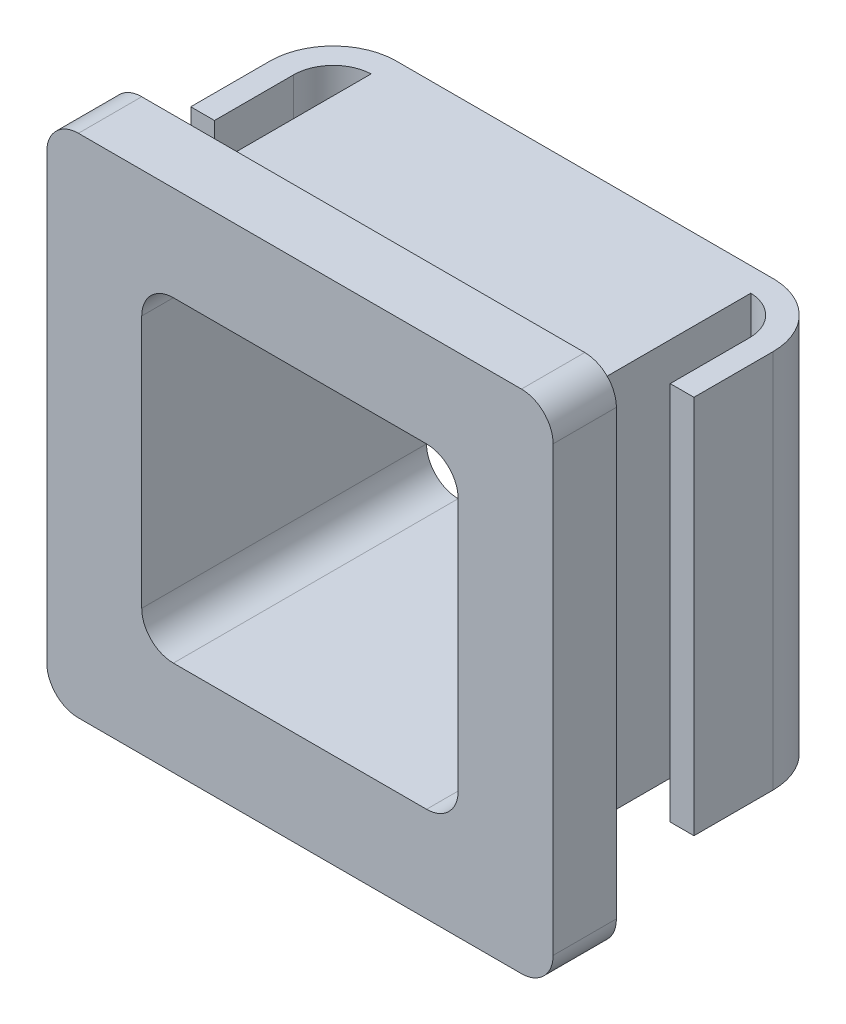
ISO-10303-21;
HEADER;
FILE_DESCRIPTION(('STEP AP214'),'2;1');
FILE_NAME('part.step','',(''),(''),'','','');
FILE_SCHEMA(('AUTOMOTIVE_DESIGN { 1 0 10303 214 1 1 1 1 }'));
ENDSEC;
DATA;
#1=APPLICATION_CONTEXT('core data for automotive mechanical design processes');
#2=APPLICATION_PROTOCOL_DEFINITION('international standard','automotive_design',2000,#1);
#3=PRODUCT_CONTEXT('',#1,'mechanical');
#4=PRODUCT('Part','Part','',(#3));
#5=PRODUCT_RELATED_PRODUCT_CATEGORY('part','',(#4));
#6=PRODUCT_DEFINITION_FORMATION('','',#4);
#7=PRODUCT_DEFINITION_CONTEXT('part definition',#1,'design');
#8=PRODUCT_DEFINITION('design','',#6,#7);
#9=PRODUCT_DEFINITION_SHAPE('','',#8);
#10=(LENGTH_UNIT() NAMED_UNIT(*) SI_UNIT(.MILLI.,.METRE.));
#11=(NAMED_UNIT(*) PLANE_ANGLE_UNIT() SI_UNIT($,.RADIAN.));
#12=(NAMED_UNIT(*) SI_UNIT($,.STERADIAN.) SOLID_ANGLE_UNIT());
#13=UNCERTAINTY_MEASURE_WITH_UNIT(LENGTH_MEASURE(1.E-05),#10,'distance_accuracy_value','');
#14=(GEOMETRIC_REPRESENTATION_CONTEXT(3) GLOBAL_UNCERTAINTY_ASSIGNED_CONTEXT((#13)) GLOBAL_UNIT_ASSIGNED_CONTEXT((#10,
#11,#12)) REPRESENTATION_CONTEXT('',''));
#15=CARTESIAN_POINT('',(0.,0.,0.));
#16=DIRECTION('',(0.,0.,1.));
#17=DIRECTION('',(1.,0.,0.));
#18=AXIS2_PLACEMENT_3D('',#15,#16,#17);
#19=CARTESIAN_POINT('',(6.,0.,-7.));
#20=DIRECTION('',(1.,0.,0.));
#21=DIRECTION('',(0.,0.,-1.));
#22=AXIS2_PLACEMENT_3D('',#19,#20,#21);
#23=PLANE('',#22);
#24=DIRECTION('',(0.,0.,1.));
#25=VECTOR('',#24,1.);
#26=CARTESIAN_POINT('',(6.,-6.,-7.));
#27=LINE('',#26,#25);
#28=CARTESIAN_POINT('',(6.,-6.,-6.24962500232614));
#29=VERTEX_POINT('',#28);
#30=CARTESIAN_POINT('',(6.,-6.,0.));
#31=VERTEX_POINT('',#30);
#32=EDGE_CURVE('E364',#29,#31,#27,.T.);
#33=ORIENTED_EDGE('',*,*,#32,.F.);
#34=DIRECTION('',(0.,1.,0.));
#35=VECTOR('',#34,1.);
#36=CARTESIAN_POINT('',(6.,-10.9045833166297,-6.24962500232614));
#37=LINE('',#36,#35);
#38=CARTESIAN_POINT('',(6.,6.,-6.24962500232614));
#39=VERTEX_POINT('',#38);
#40=EDGE_CURVE('E260',#29,#39,#37,.T.);
#41=ORIENTED_EDGE('',*,*,#40,.T.);
#42=DIRECTION('',(0.,0.,1.));
#43=VECTOR('',#42,1.);
#44=CARTESIAN_POINT('',(6.,6.,-7.));
#45=LINE('',#44,#43);
#46=CARTESIAN_POINT('',(6.,6.,0.));
#47=VERTEX_POINT('',#46);
#48=EDGE_CURVE('E275',#39,#47,#45,.T.);
#49=ORIENTED_EDGE('',*,*,#48,.T.);
#50=DIRECTION('',(0.,1.,0.));
#51=VECTOR('',#50,1.);
#52=CARTESIAN_POINT('',(6.,0.,0.));
#53=LINE('',#52,#51);
#54=EDGE_CURVE('E355',#31,#47,#53,.T.);
#55=ORIENTED_EDGE('',*,*,#54,.F.);
#56=EDGE_LOOP('',(#33,#41,#49,#55));
#57=FACE_BOUND('',#56,.T.);
#58=ADVANCED_FACE('F38',(#57),#23,.T.);
#59=CARTESIAN_POINT('',(0.,0.,0.));
#60=DIRECTION('',(0.,0.,-1.));
#61=DIRECTION('',(-1.,0.,0.));
#62=AXIS2_PLACEMENT_3D('',#59,#60,#61);
#63=PLANE('',#62);
#64=DIRECTION('',(0.,-1.,0.));
#65=VECTOR('',#64,1.);
#66=CARTESIAN_POINT('',(-8.,-8.,0.));
#67=LINE('',#66,#65);
#68=CARTESIAN_POINT('',(-8.,7.,0.));
#69=VERTEX_POINT('',#68);
#70=CARTESIAN_POINT('',(-8.,-7.,0.));
#71=VERTEX_POINT('',#70);
#72=EDGE_CURVE('E396',#69,#71,#67,.T.);
#73=ORIENTED_EDGE('',*,*,#72,.F.);
#74=CARTESIAN_POINT('',(-7.,7.,0.));
#75=DIRECTION('',(0.,0.,-1.));
#76=DIRECTION('',(-1.,0.,0.));
#77=AXIS2_PLACEMENT_3D('',#74,#75,#76);
#78=CIRCLE('',#77,1.);
#79=CARTESIAN_POINT('',(-7.,8.,0.));
#80=VERTEX_POINT('',#79);
#81=EDGE_CURVE('E448',#69,#80,#78,.T.);
#82=ORIENTED_EDGE('',*,*,#81,.T.);
#83=DIRECTION('',(-1.,0.,0.));
#84=VECTOR('',#83,1.);
#85=CARTESIAN_POINT('',(-8.,8.,0.));
#86=LINE('',#85,#84);
#87=CARTESIAN_POINT('',(7.,8.,0.));
#88=VERTEX_POINT('',#87);
#89=EDGE_CURVE('E393',#88,#80,#86,.T.);
#90=ORIENTED_EDGE('',*,*,#89,.F.);
#91=CARTESIAN_POINT('',(7.,7.,0.));
#92=DIRECTION('',(0.,0.,-1.));
#93=DIRECTION('',(-1.,0.,0.));
#94=AXIS2_PLACEMENT_3D('',#91,#92,#93);
#95=CIRCLE('',#94,1.);
#96=CARTESIAN_POINT('',(8.,7.,0.));
#97=VERTEX_POINT('',#96);
#98=EDGE_CURVE('E442',#88,#97,#95,.T.);
#99=ORIENTED_EDGE('',*,*,#98,.T.);
#100=DIRECTION('',(0.,1.,0.));
#101=VECTOR('',#100,1.);
#102=CARTESIAN_POINT('',(8.,-8.,0.));
#103=LINE('',#102,#101);
#104=CARTESIAN_POINT('',(8.,-7.,0.));
#105=VERTEX_POINT('',#104);
#106=EDGE_CURVE('E378',#105,#97,#103,.T.);
#107=ORIENTED_EDGE('',*,*,#106,.F.);
#108=CARTESIAN_POINT('',(7.,-7.,0.));
#109=DIRECTION('',(0.,0.,-1.));
#110=DIRECTION('',(-1.,0.,0.));
#111=AXIS2_PLACEMENT_3D('',#108,#109,#110);
#112=CIRCLE('',#111,1.);
#113=CARTESIAN_POINT('',(7.,-8.,0.));
#114=VERTEX_POINT('',#113);
#115=EDGE_CURVE('E444',#105,#114,#112,.T.);
#116=ORIENTED_EDGE('',*,*,#115,.T.);
#117=DIRECTION('',(1.,0.,0.));
#118=VECTOR('',#117,1.);
#119=CARTESIAN_POINT('',(-8.,-8.,0.));
#120=LINE('',#119,#118);
#121=CARTESIAN_POINT('',(-7.,-8.,0.));
#122=VERTEX_POINT('',#121);
#123=EDGE_CURVE('E383',#122,#114,#120,.T.);
#124=ORIENTED_EDGE('',*,*,#123,.F.);
#125=CARTESIAN_POINT('',(-7.,-7.,0.));
#126=DIRECTION('',(0.,0.,-1.));
#127=DIRECTION('',(-1.,0.,0.));
#128=AXIS2_PLACEMENT_3D('',#125,#126,#127);
#129=CIRCLE('',#128,1.);
#130=EDGE_CURVE('E446',#122,#71,#129,.T.);
#131=ORIENTED_EDGE('',*,*,#130,.T.);
#132=EDGE_LOOP('',(#73,#82,#90,#99,#107,#116,#124,#131));
#133=FACE_BOUND('',#132,.T.);
#134=DIRECTION('',(-1.,0.,0.));
#135=VECTOR('',#134,1.);
#136=CARTESIAN_POINT('',(0.,6.,0.));
#137=LINE('',#136,#135);
#138=CARTESIAN_POINT('',(-6.,6.,0.));
#139=VERTEX_POINT('',#138);
#140=EDGE_CURVE('E334',#47,#139,#137,.T.);
#141=ORIENTED_EDGE('',*,*,#140,.T.);
#142=DIRECTION('',(0.,1.,0.));
#143=VECTOR('',#142,1.);
#144=CARTESIAN_POINT('',(-6.,0.,0.));
#145=LINE('',#144,#143);
#146=CARTESIAN_POINT('',(-6.,-6.,0.));
#147=VERTEX_POINT('',#146);
#148=EDGE_CURVE('E329',#147,#139,#145,.T.);
#149=ORIENTED_EDGE('',*,*,#148,.F.);
#150=DIRECTION('',(-1.,0.,0.));
#151=VECTOR('',#150,1.);
#152=CARTESIAN_POINT('',(0.,-6.,0.));
#153=LINE('',#152,#151);
#154=EDGE_CURVE('E352',#31,#147,#153,.T.);
#155=ORIENTED_EDGE('',*,*,#154,.F.);
#156=ORIENTED_EDGE('',*,*,#54,.T.);
#157=EDGE_LOOP('',(#141,#149,#155,#156));
#158=FACE_BOUND('',#157,.T.);
#159=ADVANCED_FACE('F532',(#133,#158),#63,.T.);
#160=CARTESIAN_POINT('',(0.,0.,2.));
#161=DIRECTION('',(0.,0.,-1.));
#162=DIRECTION('',(-1.,0.,0.));
#163=AXIS2_PLACEMENT_3D('',#160,#161,#162);
#164=PLANE('',#163);
#165=DIRECTION('',(-1.,0.,0.));
#166=VECTOR('',#165,1.);
#167=CARTESIAN_POINT('',(-8.,8.,2.));
#168=LINE('',#167,#166);
#169=CARTESIAN_POINT('',(7.,8.,2.));
#170=VERTEX_POINT('',#169);
#171=CARTESIAN_POINT('',(-7.,8.,2.));
#172=VERTEX_POINT('',#171);
#173=EDGE_CURVE('E382',#170,#172,#168,.T.);
#174=ORIENTED_EDGE('',*,*,#173,.T.);
#175=CARTESIAN_POINT('',(-7.,7.,2.));
#176=DIRECTION('',(0.,0.,-1.));
#177=DIRECTION('',(-1.,0.,0.));
#178=AXIS2_PLACEMENT_3D('',#175,#176,#177);
#179=CIRCLE('',#178,1.);
#180=CARTESIAN_POINT('',(-8.,7.,2.));
#181=VERTEX_POINT('',#180);
#182=EDGE_CURVE('E460',#172,#181,#179,.F.);
#183=ORIENTED_EDGE('',*,*,#182,.T.);
#184=DIRECTION('',(0.,-1.,0.));
#185=VECTOR('',#184,1.);
#186=CARTESIAN_POINT('',(-8.,-8.,2.));
#187=LINE('',#186,#185);
#188=CARTESIAN_POINT('',(-8.,-7.,2.));
#189=VERTEX_POINT('',#188);
#190=EDGE_CURVE('E386',#181,#189,#187,.T.);
#191=ORIENTED_EDGE('',*,*,#190,.T.);
#192=CARTESIAN_POINT('',(-7.,-7.,2.));
#193=DIRECTION('',(0.,0.,-1.));
#194=DIRECTION('',(-1.,0.,0.));
#195=AXIS2_PLACEMENT_3D('',#192,#193,#194);
#196=CIRCLE('',#195,1.);
#197=CARTESIAN_POINT('',(-7.,-8.,2.));
#198=VERTEX_POINT('',#197);
#199=EDGE_CURVE('E60',#189,#198,#196,.F.);
#200=ORIENTED_EDGE('',*,*,#199,.T.);
#201=DIRECTION('',(1.,0.,0.));
#202=VECTOR('',#201,1.);
#203=CARTESIAN_POINT('',(-8.,-8.,2.));
#204=LINE('',#203,#202);
#205=CARTESIAN_POINT('',(7.,-8.,2.));
#206=VERTEX_POINT('',#205);
#207=EDGE_CURVE('E388',#198,#206,#204,.T.);
#208=ORIENTED_EDGE('',*,*,#207,.T.);
#209=CARTESIAN_POINT('',(7.,-7.,2.));
#210=DIRECTION('',(0.,0.,-1.));
#211=DIRECTION('',(-1.,0.,0.));
#212=AXIS2_PLACEMENT_3D('',#209,#210,#211);
#213=CIRCLE('',#212,1.);
#214=CARTESIAN_POINT('',(8.,-7.,2.));
#215=VERTEX_POINT('',#214);
#216=EDGE_CURVE('E457',#206,#215,#213,.F.);
#217=ORIENTED_EDGE('',*,*,#216,.T.);
#218=DIRECTION('',(0.,1.,0.));
#219=VECTOR('',#218,1.);
#220=CARTESIAN_POINT('',(8.,-8.,2.));
#221=LINE('',#220,#219);
#222=CARTESIAN_POINT('',(8.,7.,2.));
#223=VERTEX_POINT('',#222);
#224=EDGE_CURVE('E379',#215,#223,#221,.T.);
#225=ORIENTED_EDGE('',*,*,#224,.T.);
#226=CARTESIAN_POINT('',(7.,7.,2.));
#227=DIRECTION('',(0.,0.,-1.));
#228=DIRECTION('',(-1.,0.,0.));
#229=AXIS2_PLACEMENT_3D('',#226,#227,#228);
#230=CIRCLE('',#229,1.);
#231=EDGE_CURVE('E455',#223,#170,#230,.F.);
#232=ORIENTED_EDGE('',*,*,#231,.T.);
#233=EDGE_LOOP('',(#174,#183,#191,#200,#208,#217,#225,#232));
#234=FACE_BOUND('',#233,.T.);
#235=DIRECTION('',(0.,1.,0.));
#236=VECTOR('',#235,1.);
#237=CARTESIAN_POINT('',(5.,-5.,2.));
#238=LINE('',#237,#236);
#239=CARTESIAN_POINT('',(5.,-4.,2.));
#240=VERTEX_POINT('',#239);
#241=CARTESIAN_POINT('',(5.,4.,2.));
#242=VERTEX_POINT('',#241);
#243=EDGE_CURVE('E362',#240,#242,#238,.T.);
#244=ORIENTED_EDGE('',*,*,#243,.F.);
#245=CARTESIAN_POINT('',(4.,-4.,2.));
#246=DIRECTION('',(0.,0.,-1.));
#247=DIRECTION('',(-1.,0.,0.));
#248=AXIS2_PLACEMENT_3D('',#245,#246,#247);
#249=CIRCLE('',#248,1.);
#250=CARTESIAN_POINT('',(4.,-5.,2.));
#251=VERTEX_POINT('',#250);
#252=EDGE_CURVE('E473',#240,#251,#249,.T.);
#253=ORIENTED_EDGE('',*,*,#252,.T.);
#254=DIRECTION('',(1.,0.,0.));
#255=VECTOR('',#254,1.);
#256=CARTESIAN_POINT('',(-5.,-5.,2.));
#257=LINE('',#256,#255);
#258=CARTESIAN_POINT('',(-4.,-5.,2.));
#259=VERTEX_POINT('',#258);
#260=EDGE_CURVE('E375',#259,#251,#257,.T.);
#261=ORIENTED_EDGE('',*,*,#260,.F.);
#262=CARTESIAN_POINT('',(-4.,-4.,2.));
#263=DIRECTION('',(0.,0.,-1.));
#264=DIRECTION('',(-1.,0.,0.));
#265=AXIS2_PLACEMENT_3D('',#262,#263,#264);
#266=CIRCLE('',#265,1.);
#267=CARTESIAN_POINT('',(-5.,-4.,2.));
#268=VERTEX_POINT('',#267);
#269=EDGE_CURVE('E477',#259,#268,#266,.T.);
#270=ORIENTED_EDGE('',*,*,#269,.T.);
#271=DIRECTION('',(0.,-1.,0.));
#272=VECTOR('',#271,1.);
#273=CARTESIAN_POINT('',(-5.,-5.,2.));
#274=LINE('',#273,#272);
#275=CARTESIAN_POINT('',(-5.,4.,2.));
#276=VERTEX_POINT('',#275);
#277=EDGE_CURVE('E372',#276,#268,#274,.T.);
#278=ORIENTED_EDGE('',*,*,#277,.F.);
#279=CARTESIAN_POINT('',(-4.,4.,2.));
#280=DIRECTION('',(0.,0.,-1.));
#281=DIRECTION('',(-1.,0.,0.));
#282=AXIS2_PLACEMENT_3D('',#279,#280,#281);
#283=CIRCLE('',#282,1.);
#284=CARTESIAN_POINT('',(-4.,5.,2.));
#285=VERTEX_POINT('',#284);
#286=EDGE_CURVE('E481',#276,#285,#283,.T.);
#287=ORIENTED_EDGE('',*,*,#286,.T.);
#288=DIRECTION('',(-1.,0.,0.));
#289=VECTOR('',#288,1.);
#290=CARTESIAN_POINT('',(-5.,5.,2.));
#291=LINE('',#290,#289);
#292=CARTESIAN_POINT('',(4.,5.,2.));
#293=VERTEX_POINT('',#292);
#294=EDGE_CURVE('E369',#293,#285,#291,.T.);
#295=ORIENTED_EDGE('',*,*,#294,.F.);
#296=CARTESIAN_POINT('',(4.,4.,2.));
#297=DIRECTION('',(0.,0.,-1.));
#298=DIRECTION('',(-1.,0.,0.));
#299=AXIS2_PLACEMENT_3D('',#296,#297,#298);
#300=CIRCLE('',#299,1.);
#301=EDGE_CURVE('E11',#293,#242,#300,.T.);
#302=ORIENTED_EDGE('',*,*,#301,.T.);
#303=EDGE_LOOP('',(#244,#253,#261,#270,#278,#287,#295,#302));
#304=FACE_BOUND('',#303,.T.);
#305=ADVANCED_FACE('F497',(#234,#304),#164,.F.);
#306=CARTESIAN_POINT('',(8.,-8.,2.));
#307=DIRECTION('',(-1.,0.,0.));
#308=DIRECTION('',(0.,0.,1.));
#309=AXIS2_PLACEMENT_3D('',#306,#307,#308);
#310=PLANE('',#309);
#311=ORIENTED_EDGE('',*,*,#224,.F.);
#312=DIRECTION('',(0.,0.,-1.));
#313=VECTOR('',#312,1.);
#314=CARTESIAN_POINT('',(8.,-7.,2.));
#315=LINE('',#314,#313);
#316=EDGE_CURVE('E468',#215,#105,#315,.T.);
#317=ORIENTED_EDGE('',*,*,#316,.T.);
#318=ORIENTED_EDGE('',*,*,#106,.T.);
#319=DIRECTION('',(0.,0.,-1.));
#320=VECTOR('',#319,1.);
#321=CARTESIAN_POINT('',(8.,7.,2.));
#322=LINE('',#321,#320);
#323=EDGE_CURVE('E466',#97,#223,#322,.F.);
#324=ORIENTED_EDGE('',*,*,#323,.T.);
#325=EDGE_LOOP('',(#311,#317,#318,#324));
#326=FACE_BOUND('',#325,.T.);
#327=ADVANCED_FACE('F561',(#326),#310,.F.);
#328=CARTESIAN_POINT('',(-8.,8.,2.));
#329=DIRECTION('',(0.,-1.,0.));
#330=DIRECTION('',(0.,0.,-1.));
#331=AXIS2_PLACEMENT_3D('',#328,#329,#330);
#332=PLANE('',#331);
#333=ORIENTED_EDGE('',*,*,#89,.T.);
#334=DIRECTION('',(0.,0.,-1.));
#335=VECTOR('',#334,1.);
#336=CARTESIAN_POINT('',(-7.,8.,2.));
#337=LINE('',#336,#335);
#338=EDGE_CURVE('E453',#80,#172,#337,.F.);
#339=ORIENTED_EDGE('',*,*,#338,.T.);
#340=ORIENTED_EDGE('',*,*,#173,.F.);
#341=DIRECTION('',(0.,0.,-1.));
#342=VECTOR('',#341,1.);
#343=CARTESIAN_POINT('',(7.,8.,2.));
#344=LINE('',#343,#342);
#345=EDGE_CURVE('E450',#170,#88,#344,.T.);
#346=ORIENTED_EDGE('',*,*,#345,.T.);
#347=EDGE_LOOP('',(#333,#339,#340,#346));
#348=FACE_BOUND('',#347,.T.);
#349=ADVANCED_FACE('F568',(#348),#332,.F.);
#350=CARTESIAN_POINT('',(-8.,-8.,2.));
#351=DIRECTION('',(1.,0.,0.));
#352=DIRECTION('',(0.,0.,-1.));
#353=AXIS2_PLACEMENT_3D('',#350,#351,#352);
#354=PLANE('',#353);
#355=ORIENTED_EDGE('',*,*,#190,.F.);
#356=DIRECTION('',(0.,0.,-1.));
#357=VECTOR('',#356,1.);
#358=CARTESIAN_POINT('',(-8.,7.,2.));
#359=LINE('',#358,#357);
#360=EDGE_CURVE('E439',#181,#69,#359,.T.);
#361=ORIENTED_EDGE('',*,*,#360,.T.);
#362=ORIENTED_EDGE('',*,*,#72,.T.);
#363=DIRECTION('',(0.,0.,-1.));
#364=VECTOR('',#363,1.);
#365=CARTESIAN_POINT('',(-8.,-7.,2.));
#366=LINE('',#365,#364);
#367=EDGE_CURVE('E437',#71,#189,#366,.F.);
#368=ORIENTED_EDGE('',*,*,#367,.T.);
#369=EDGE_LOOP('',(#355,#361,#362,#368));
#370=FACE_BOUND('',#369,.T.);
#371=ADVANCED_FACE('F565',(#370),#354,.F.);
#372=CARTESIAN_POINT('',(-8.,-8.,2.));
#373=DIRECTION('',(0.,1.,0.));
#374=DIRECTION('',(0.,0.,1.));
#375=AXIS2_PLACEMENT_3D('',#372,#373,#374);
#376=PLANE('',#375);
#377=ORIENTED_EDGE('',*,*,#207,.F.);
#378=DIRECTION('',(0.,0.,-1.));
#379=VECTOR('',#378,1.);
#380=CARTESIAN_POINT('',(-7.,-8.,2.));
#381=LINE('',#380,#379);
#382=EDGE_CURVE('E463',#198,#122,#381,.T.);
#383=ORIENTED_EDGE('',*,*,#382,.T.);
#384=ORIENTED_EDGE('',*,*,#123,.T.);
#385=DIRECTION('',(0.,0.,-1.));
#386=VECTOR('',#385,1.);
#387=CARTESIAN_POINT('',(7.,-8.,2.));
#388=LINE('',#387,#386);
#389=EDGE_CURVE('E53',#114,#206,#388,.F.);
#390=ORIENTED_EDGE('',*,*,#389,.T.);
#391=EDGE_LOOP('',(#377,#383,#384,#390));
#392=FACE_BOUND('',#391,.T.);
#393=ADVANCED_FACE('F559',(#392),#376,.F.);
#394=CARTESIAN_POINT('',(5.,-5.,2.));
#395=DIRECTION('',(-1.,0.,0.));
#396=DIRECTION('',(0.,0.,1.));
#397=AXIS2_PLACEMENT_3D('',#394,#395,#396);
#398=PLANE('',#397);
#399=DIRECTION('',(0.,1.,0.));
#400=VECTOR('',#399,1.);
#401=CARTESIAN_POINT('',(5.,0.,-7.));
#402=LINE('',#401,#400);
#403=CARTESIAN_POINT('',(5.,-4.,-7.));
#404=VERTEX_POINT('',#403);
#405=CARTESIAN_POINT('',(5.,4.,-7.));
#406=VERTEX_POINT('',#405);
#407=EDGE_CURVE('E343',#404,#406,#402,.T.);
#408=ORIENTED_EDGE('',*,*,#407,.F.);
#409=DIRECTION('',(0.,0.,-1.));
#410=VECTOR('',#409,1.);
#411=CARTESIAN_POINT('',(5.,-4.,2.));
#412=LINE('',#411,#410);
#413=EDGE_CURVE('E425',#404,#240,#412,.F.);
#414=ORIENTED_EDGE('',*,*,#413,.T.);
#415=ORIENTED_EDGE('',*,*,#243,.T.);
#416=DIRECTION('',(0.,0.,-1.));
#417=VECTOR('',#416,1.);
#418=CARTESIAN_POINT('',(5.,4.,-7.));
#419=LINE('',#418,#417);
#420=EDGE_CURVE('E422',#242,#406,#419,.T.);
#421=ORIENTED_EDGE('',*,*,#420,.T.);
#422=EDGE_LOOP('',(#408,#414,#415,#421));
#423=FACE_BOUND('',#422,.T.);
#424=ADVANCED_FACE('F500',(#423),#398,.T.);
#425=CARTESIAN_POINT('',(-5.,5.,2.));
#426=DIRECTION('',(0.,-1.,0.));
#427=DIRECTION('',(0.,0.,-1.));
#428=AXIS2_PLACEMENT_3D('',#425,#426,#427);
#429=PLANE('',#428);
#430=ORIENTED_EDGE('',*,*,#294,.T.);
#431=DIRECTION('',(0.,0.,-1.));
#432=VECTOR('',#431,1.);
#433=CARTESIAN_POINT('',(-4.,5.,-7.));
#434=LINE('',#433,#432);
#435=CARTESIAN_POINT('',(-4.,5.,-7.));
#436=VERTEX_POINT('',#435);
#437=EDGE_CURVE('E434',#285,#436,#434,.T.);
#438=ORIENTED_EDGE('',*,*,#437,.T.);
#439=DIRECTION('',(-1.,0.,0.));
#440=VECTOR('',#439,1.);
#441=CARTESIAN_POINT('',(0.,5.,-7.));
#442=LINE('',#441,#440);
#443=CARTESIAN_POINT('',(4.,5.,-7.));
#444=VERTEX_POINT('',#443);
#445=EDGE_CURVE('E340',#444,#436,#442,.T.);
#446=ORIENTED_EDGE('',*,*,#445,.F.);
#447=DIRECTION('',(0.,0.,-1.));
#448=VECTOR('',#447,1.);
#449=CARTESIAN_POINT('',(4.,5.,2.));
#450=LINE('',#449,#448);
#451=EDGE_CURVE('E432',#444,#293,#450,.F.);
#452=ORIENTED_EDGE('',*,*,#451,.T.);
#453=EDGE_LOOP('',(#430,#438,#446,#452));
#454=FACE_BOUND('',#453,.T.);
#455=ADVANCED_FACE('F490',(#454),#429,.T.);
#456=CARTESIAN_POINT('',(-5.,-5.,2.));
#457=DIRECTION('',(1.,0.,0.));
#458=DIRECTION('',(0.,0.,-1.));
#459=AXIS2_PLACEMENT_3D('',#456,#457,#458);
#460=PLANE('',#459);
#461=ORIENTED_EDGE('',*,*,#277,.T.);
#462=DIRECTION('',(0.,0.,-1.));
#463=VECTOR('',#462,1.);
#464=CARTESIAN_POINT('',(-5.,-4.,-7.));
#465=LINE('',#464,#463);
#466=CARTESIAN_POINT('',(-5.,-4.,-7.));
#467=VERTEX_POINT('',#466);
#468=EDGE_CURVE('E429',#268,#467,#465,.T.);
#469=ORIENTED_EDGE('',*,*,#468,.T.);
#470=DIRECTION('',(0.,-1.,0.));
#471=VECTOR('',#470,1.);
#472=CARTESIAN_POINT('',(-5.,0.,-7.));
#473=LINE('',#472,#471);
#474=CARTESIAN_POINT('',(-5.,4.,-7.));
#475=VERTEX_POINT('',#474);
#476=EDGE_CURVE('E337',#475,#467,#473,.T.);
#477=ORIENTED_EDGE('',*,*,#476,.F.);
#478=DIRECTION('',(0.,0.,-1.));
#479=VECTOR('',#478,1.);
#480=CARTESIAN_POINT('',(-5.,4.,2.));
#481=LINE('',#480,#479);
#482=EDGE_CURVE('E427',#475,#276,#481,.F.);
#483=ORIENTED_EDGE('',*,*,#482,.T.);
#484=EDGE_LOOP('',(#461,#469,#477,#483));
#485=FACE_BOUND('',#484,.T.);
#486=ADVANCED_FACE('F517',(#485),#460,.T.);
#487=CARTESIAN_POINT('',(-5.,-5.,2.));
#488=DIRECTION('',(0.,1.,0.));
#489=DIRECTION('',(0.,0.,1.));
#490=AXIS2_PLACEMENT_3D('',#487,#488,#489);
#491=PLANE('',#490);
#492=ORIENTED_EDGE('',*,*,#260,.T.);
#493=DIRECTION('',(0.,0.,-1.));
#494=VECTOR('',#493,1.);
#495=CARTESIAN_POINT('',(4.,-5.,-7.));
#496=LINE('',#495,#494);
#497=CARTESIAN_POINT('',(4.,-5.,-7.));
#498=VERTEX_POINT('',#497);
#499=EDGE_CURVE('E419',#251,#498,#496,.T.);
#500=ORIENTED_EDGE('',*,*,#499,.T.);
#501=DIRECTION('',(1.,0.,0.));
#502=VECTOR('',#501,1.);
#503=CARTESIAN_POINT('',(0.,-5.,-7.));
#504=LINE('',#503,#502);
#505=CARTESIAN_POINT('',(-4.,-5.,-7.));
#506=VERTEX_POINT('',#505);
#507=EDGE_CURVE('E346',#506,#498,#504,.T.);
#508=ORIENTED_EDGE('',*,*,#507,.F.);
#509=DIRECTION('',(0.,0.,-1.));
#510=VECTOR('',#509,1.);
#511=CARTESIAN_POINT('',(-4.,-5.,2.));
#512=LINE('',#511,#510);
#513=EDGE_CURVE('E417',#506,#259,#512,.F.);
#514=ORIENTED_EDGE('',*,*,#513,.T.);
#515=EDGE_LOOP('',(#492,#500,#508,#514));
#516=FACE_BOUND('',#515,.T.);
#517=ADVANCED_FACE('F508',(#516),#491,.T.);
#518=CARTESIAN_POINT('',(-6.,0.,-7.));
#519=DIRECTION('',(1.,0.,0.));
#520=DIRECTION('',(0.,0.,-1.));
#521=AXIS2_PLACEMENT_3D('',#518,#519,#520);
#522=PLANE('',#521);
#523=DIRECTION('',(0.,0.,1.));
#524=VECTOR('',#523,1.);
#525=CARTESIAN_POINT('',(-6.,6.,-7.));
#526=LINE('',#525,#524);
#527=CARTESIAN_POINT('',(-6.,6.,-6.24962500232614));
#528=VERTEX_POINT('',#527);
#529=EDGE_CURVE('E360',#528,#139,#526,.T.);
#530=ORIENTED_EDGE('',*,*,#529,.F.);
#531=DIRECTION('',(0.,1.,0.));
#532=VECTOR('',#531,1.);
#533=CARTESIAN_POINT('',(-6.,-10.9045833166297,-6.24962500232614));
#534=LINE('',#533,#532);
#535=CARTESIAN_POINT('',(-6.,-6.,-6.24962500232614));
#536=VERTEX_POINT('',#535);
#537=EDGE_CURVE('E295',#536,#528,#534,.T.);
#538=ORIENTED_EDGE('',*,*,#537,.F.);
#539=DIRECTION('',(0.,0.,1.));
#540=VECTOR('',#539,1.);
#541=CARTESIAN_POINT('',(-6.,-6.,-7.));
#542=LINE('',#541,#540);
#543=EDGE_CURVE('E349',#536,#147,#542,.T.);
#544=ORIENTED_EDGE('',*,*,#543,.T.);
#545=ORIENTED_EDGE('',*,*,#148,.T.);
#546=EDGE_LOOP('',(#530,#538,#544,#545));
#547=FACE_BOUND('',#546,.T.);
#548=ADVANCED_FACE('F547',(#547),#522,.F.);
#549=CARTESIAN_POINT('',(0.,6.,-7.));
#550=DIRECTION('',(0.,1.,0.));
#551=DIRECTION('',(-1.,0.,0.));
#552=AXIS2_PLACEMENT_3D('',#549,#550,#551);
#553=PLANE('',#552);
#554=CARTESIAN_POINT('',(5.95,6.,-5.));
#555=DIRECTION('',(0.,-1.,0.));
#556=DIRECTION('',(1.,0.,0.));
#557=AXIS2_PLACEMENT_3D('',#554,#555,#556);
#558=CIRCLE('',#557,2.00062490237426);
#559=CARTESIAN_POINT('',(6.02069411888706,6.,-6.99937548788485));
#560=VERTEX_POINT('',#559);
#561=CARTESIAN_POINT('',(7.95062490237425,6.,-5.));
#562=VERTEX_POINT('',#561);
#563=EDGE_CURVE('E276',#560,#562,#558,.T.);
#564=ORIENTED_EDGE('',*,*,#563,.F.);
#565=CARTESIAN_POINT('',(5.98535810022451,6.,-6.));
#566=DIRECTION('',(0.,1.,0.));
#567=DIRECTION('',(-1.,0.,0.));
#568=AXIS2_PLACEMENT_3D('',#565,#566,#567);
#569=CIRCLE('',#568,1.);
#570=CARTESIAN_POINT('',(5.98535810022451,6.,-7.));
#571=VERTEX_POINT('',#570);
#572=EDGE_CURVE('E404',#560,#571,#569,.T.);
#573=ORIENTED_EDGE('',*,*,#572,.T.);
#574=DIRECTION('',(-1.,0.,0.));
#575=VECTOR('',#574,1.);
#576=CARTESIAN_POINT('',(0.,6.,-7.));
#577=LINE('',#576,#575);
#578=CARTESIAN_POINT('',(-5.98535810022451,6.,-7.));
#579=VERTEX_POINT('',#578);
#580=EDGE_CURVE('E333',#571,#579,#577,.T.);
#581=ORIENTED_EDGE('',*,*,#580,.T.);
#582=CARTESIAN_POINT('',(-5.98535810022451,6.,-6.));
#583=DIRECTION('',(0.,1.,0.));
#584=DIRECTION('',(-1.,0.,0.));
#585=AXIS2_PLACEMENT_3D('',#582,#583,#584);
#586=CIRCLE('',#585,1.);
#587=CARTESIAN_POINT('',(-6.02069411888706,6.,-6.99937548788485));
#588=VERTEX_POINT('',#587);
#589=EDGE_CURVE('E402',#579,#588,#586,.T.);
#590=ORIENTED_EDGE('',*,*,#589,.T.);
#591=CARTESIAN_POINT('',(-5.95,6.,-5.));
#592=DIRECTION('',(0.,1.,0.));
#593=DIRECTION('',(-1.,0.,0.));
#594=AXIS2_PLACEMENT_3D('',#591,#592,#593);
#595=CIRCLE('',#594,2.00062490237426);
#596=CARTESIAN_POINT('',(-7.95062490237425,6.,-5.));
#597=VERTEX_POINT('',#596);
#598=EDGE_CURVE('E303',#588,#597,#595,.T.);
#599=ORIENTED_EDGE('',*,*,#598,.T.);
#600=DIRECTION('',(0.,0.,1.));
#601=VECTOR('',#600,1.);
#602=CARTESIAN_POINT('',(-7.95062490237425,6.,-5.));
#603=LINE('',#602,#601);
#604=CARTESIAN_POINT('',(-7.95062490237425,6.,-2.5));
#605=VERTEX_POINT('',#604);
#606=EDGE_CURVE('E305',#597,#605,#603,.T.);
#607=ORIENTED_EDGE('',*,*,#606,.T.);
#608=DIRECTION('',(1.,0.,0.));
#609=VECTOR('',#608,1.);
#610=CARTESIAN_POINT('',(-7.95062490237425,6.,-2.5));
#611=LINE('',#610,#609);
#612=CARTESIAN_POINT('',(-7.20062490237425,6.,-2.5));
#613=VERTEX_POINT('',#612);
#614=EDGE_CURVE('E309',#605,#613,#611,.T.);
#615=ORIENTED_EDGE('',*,*,#614,.T.);
#616=DIRECTION('',(0.,0.,-1.));
#617=VECTOR('',#616,1.);
#618=CARTESIAN_POINT('',(-7.20062490237425,6.,-2.5));
#619=LINE('',#618,#617);
#620=CARTESIAN_POINT('',(-7.20062490237425,6.,-5.));
#621=VERTEX_POINT('',#620);
#622=EDGE_CURVE('E312',#613,#621,#619,.T.);
#623=ORIENTED_EDGE('',*,*,#622,.T.);
#624=CARTESIAN_POINT('',(-5.95,6.,-5.));
#625=DIRECTION('',(0.,-1.,0.));
#626=DIRECTION('',(-1.,0.,0.));
#627=AXIS2_PLACEMENT_3D('',#624,#625,#626);
#628=CIRCLE('',#627,1.25062490237426);
#629=EDGE_CURVE('E315',#621,#528,#628,.T.);
#630=ORIENTED_EDGE('',*,*,#629,.T.);
#631=ORIENTED_EDGE('',*,*,#529,.T.);
#632=ORIENTED_EDGE('',*,*,#140,.F.);
#633=ORIENTED_EDGE('',*,*,#48,.F.);
#634=CARTESIAN_POINT('',(5.95,6.,-5.));
#635=DIRECTION('',(0.,1.,0.));
#636=DIRECTION('',(1.,0.,0.));
#637=AXIS2_PLACEMENT_3D('',#634,#635,#636);
#638=CIRCLE('',#637,1.25062490237426);
#639=CARTESIAN_POINT('',(7.20062490237425,6.,-5.));
#640=VERTEX_POINT('',#639);
#641=EDGE_CURVE('E254',#640,#39,#638,.T.);
#642=ORIENTED_EDGE('',*,*,#641,.F.);
#643=DIRECTION('',(0.,0.,-1.));
#644=VECTOR('',#643,1.);
#645=CARTESIAN_POINT('',(7.20062490237425,6.,-2.5));
#646=LINE('',#645,#644);
#647=CARTESIAN_POINT('',(7.20062490237425,6.,-2.5));
#648=VERTEX_POINT('',#647);
#649=EDGE_CURVE('E263',#648,#640,#646,.T.);
#650=ORIENTED_EDGE('',*,*,#649,.F.);
#651=DIRECTION('',(-1.,0.,0.));
#652=VECTOR('',#651,1.);
#653=CARTESIAN_POINT('',(7.95062490237425,6.,-2.5));
#654=LINE('',#653,#652);
#655=CARTESIAN_POINT('',(7.95062490237425,6.,-2.5));
#656=VERTEX_POINT('',#655);
#657=EDGE_CURVE('E269',#656,#648,#654,.T.);
#658=ORIENTED_EDGE('',*,*,#657,.F.);
#659=DIRECTION('',(0.,0.,1.));
#660=VECTOR('',#659,1.);
#661=CARTESIAN_POINT('',(7.95062490237425,6.,-5.));
#662=LINE('',#661,#660);
#663=EDGE_CURVE('E282',#562,#656,#662,.T.);
#664=ORIENTED_EDGE('',*,*,#663,.F.);
#665=EDGE_LOOP('',(#564,#573,#581,#590,#599,#607,#615,#623,#630,#631,#632,#633,#642,#650,#658,#664));
#666=FACE_BOUND('',#665,.T.);
#667=ADVANCED_FACE('F273',(#666),#553,.T.);
#668=CARTESIAN_POINT('',(0.,-6.,-7.));
#669=DIRECTION('',(0.,1.,0.));
#670=DIRECTION('',(-1.,0.,0.));
#671=AXIS2_PLACEMENT_3D('',#668,#669,#670);
#672=PLANE('',#671);
#673=DIRECTION('',(-1.,0.,0.));
#674=VECTOR('',#673,1.);
#675=CARTESIAN_POINT('',(0.,-6.,-7.));
#676=LINE('',#675,#674);
#677=CARTESIAN_POINT('',(5.9853581002245,-6.,-7.));
#678=VERTEX_POINT('',#677);
#679=CARTESIAN_POINT('',(-5.9853581002245,-6.,-7.));
#680=VERTEX_POINT('',#679);
#681=EDGE_CURVE('E330',#678,#680,#676,.T.);
#682=ORIENTED_EDGE('',*,*,#681,.F.);
#683=CARTESIAN_POINT('',(5.9853581002245,-6.,-6.));
#684=DIRECTION('',(0.,1.,0.));
#685=DIRECTION('',(-1.,0.,0.));
#686=AXIS2_PLACEMENT_3D('',#683,#684,#685);
#687=CIRCLE('',#686,1.);
#688=CARTESIAN_POINT('',(6.02069411888705,-6.,-6.99937548788485));
#689=VERTEX_POINT('',#688);
#690=EDGE_CURVE('E413',#678,#689,#687,.F.);
#691=ORIENTED_EDGE('',*,*,#690,.T.);
#692=CARTESIAN_POINT('',(5.95,-6.,-5.));
#693=DIRECTION('',(0.,1.,0.));
#694=DIRECTION('',(-1.,0.,0.));
#695=AXIS2_PLACEMENT_3D('',#692,#693,#694);
#696=CIRCLE('',#695,2.00062490237426);
#697=CARTESIAN_POINT('',(7.95062490237425,-6.,-5.));
#698=VERTEX_POINT('',#697);
#699=EDGE_CURVE('E306',#698,#689,#696,.T.);
#700=ORIENTED_EDGE('',*,*,#699,.F.);
#701=DIRECTION('',(0.,0.,-1.));
#702=VECTOR('',#701,1.);
#703=CARTESIAN_POINT('',(7.95062490237425,-6.,-5.));
#704=LINE('',#703,#702);
#705=CARTESIAN_POINT('',(7.95062490237425,-6.,-2.5));
#706=VERTEX_POINT('',#705);
#707=EDGE_CURVE('E677',#706,#698,#704,.T.);
#708=ORIENTED_EDGE('',*,*,#707,.F.);
#709=DIRECTION('',(1.,0.,0.));
#710=VECTOR('',#709,1.);
#711=CARTESIAN_POINT('',(7.95062490237425,-6.,-2.5));
#712=LINE('',#711,#710);
#713=CARTESIAN_POINT('',(7.20062490237425,-6.,-2.5));
#714=VERTEX_POINT('',#713);
#715=EDGE_CURVE('E672',#714,#706,#712,.T.);
#716=ORIENTED_EDGE('',*,*,#715,.F.);
#717=DIRECTION('',(0.,0.,1.));
#718=VECTOR('',#717,1.);
#719=CARTESIAN_POINT('',(7.20062490237425,-6.,-2.5));
#720=LINE('',#719,#718);
#721=CARTESIAN_POINT('',(7.20062490237425,-6.,-5.));
#722=VERTEX_POINT('',#721);
#723=EDGE_CURVE('E670',#722,#714,#720,.T.);
#724=ORIENTED_EDGE('',*,*,#723,.F.);
#725=CARTESIAN_POINT('',(5.95,-6.,-5.));
#726=DIRECTION('',(0.,1.,0.));
#727=DIRECTION('',(-1.,0.,0.));
#728=AXIS2_PLACEMENT_3D('',#725,#726,#727);
#729=CIRCLE('',#728,1.25062490237426);
#730=EDGE_CURVE('E256',#29,#722,#729,.F.);
#731=ORIENTED_EDGE('',*,*,#730,.F.);
#732=ORIENTED_EDGE('',*,*,#32,.T.);
#733=ORIENTED_EDGE('',*,*,#154,.T.);
#734=ORIENTED_EDGE('',*,*,#543,.F.);
#735=CARTESIAN_POINT('',(-5.95,-6.,-5.));
#736=DIRECTION('',(0.,1.,0.));
#737=DIRECTION('',(-1.,0.,0.));
#738=AXIS2_PLACEMENT_3D('',#735,#736,#737);
#739=CIRCLE('',#738,1.25062490237426);
#740=CARTESIAN_POINT('',(-7.20062490237425,-6.,-5.));
#741=VERTEX_POINT('',#740);
#742=EDGE_CURVE('E297',#536,#741,#739,.T.);
#743=ORIENTED_EDGE('',*,*,#742,.T.);
#744=DIRECTION('',(0.,0.,1.));
#745=VECTOR('',#744,1.);
#746=CARTESIAN_POINT('',(-7.20062490237425,-6.,-2.5));
#747=LINE('',#746,#745);
#748=CARTESIAN_POINT('',(-7.20062490237425,-6.,-2.5));
#749=VERTEX_POINT('',#748);
#750=EDGE_CURVE('E294',#741,#749,#747,.T.);
#751=ORIENTED_EDGE('',*,*,#750,.T.);
#752=DIRECTION('',(-1.,0.,0.));
#753=VECTOR('',#752,1.);
#754=CARTESIAN_POINT('',(-7.95062490237425,-6.,-2.5));
#755=LINE('',#754,#753);
#756=CARTESIAN_POINT('',(-7.95062490237425,-6.,-2.5));
#757=VERTEX_POINT('',#756);
#758=EDGE_CURVE('E292',#749,#757,#755,.T.);
#759=ORIENTED_EDGE('',*,*,#758,.T.);
#760=DIRECTION('',(0.,0.,-1.));
#761=VECTOR('',#760,1.);
#762=CARTESIAN_POINT('',(-7.95062490237425,-6.,-5.));
#763=LINE('',#762,#761);
#764=CARTESIAN_POINT('',(-7.95062490237425,-6.,-5.));
#765=VERTEX_POINT('',#764);
#766=EDGE_CURVE('E302',#757,#765,#763,.T.);
#767=ORIENTED_EDGE('',*,*,#766,.T.);
#768=CARTESIAN_POINT('',(-5.95,-6.,-5.));
#769=DIRECTION('',(0.,1.,0.));
#770=DIRECTION('',(-1.,0.,0.));
#771=AXIS2_PLACEMENT_3D('',#768,#769,#770);
#772=CIRCLE('',#771,2.00062490237426);
#773=CARTESIAN_POINT('',(-6.02069411888705,-6.,-6.99937548788485));
#774=VERTEX_POINT('',#773);
#775=EDGE_CURVE('E299',#765,#774,#772,.F.);
#776=ORIENTED_EDGE('',*,*,#775,.T.);
#777=CARTESIAN_POINT('',(-5.9853581002245,-6.,-6.));
#778=DIRECTION('',(0.,1.,0.));
#779=DIRECTION('',(-1.,0.,0.));
#780=AXIS2_PLACEMENT_3D('',#777,#778,#779);
#781=CIRCLE('',#780,1.);
#782=EDGE_CURVE('E411',#774,#680,#781,.F.);
#783=ORIENTED_EDGE('',*,*,#782,.T.);
#784=EDGE_LOOP('',(#682,#691,#700,#708,#716,#724,#731,#732,#733,#734,#743,#751,#759,#767,#776,#783));
#785=FACE_BOUND('',#784,.T.);
#786=ADVANCED_FACE('F543',(#785),#672,.F.);
#787=CARTESIAN_POINT('',(0.,0.,-7.));
#788=DIRECTION('',(0.,0.,1.));
#789=DIRECTION('',(1.,0.,0.));
#790=AXIS2_PLACEMENT_3D('',#787,#788,#789);
#791=PLANE('',#790);
#792=ORIENTED_EDGE('',*,*,#580,.F.);
#793=DIRECTION('',(0.,1.,0.));
#794=VECTOR('',#793,1.);
#795=CARTESIAN_POINT('',(5.98535810022451,0.,-7.));
#796=LINE('',#795,#794);
#797=EDGE_CURVE('E409',#571,#678,#796,.F.);
#798=ORIENTED_EDGE('',*,*,#797,.T.);
#799=ORIENTED_EDGE('',*,*,#681,.T.);
#800=DIRECTION('',(0.,-1.,0.));
#801=VECTOR('',#800,1.);
#802=CARTESIAN_POINT('',(-5.98535810022451,6.,-7.));
#803=LINE('',#802,#801);
#804=EDGE_CURVE('E406',#680,#579,#803,.F.);
#805=ORIENTED_EDGE('',*,*,#804,.T.);
#806=EDGE_LOOP('',(#792,#798,#799,#805));
#807=FACE_BOUND('',#806,.T.);
#808=ORIENTED_EDGE('',*,*,#445,.T.);
#809=CARTESIAN_POINT('',(-4.,4.,-7.));
#810=DIRECTION('',(0.,0.,1.));
#811=DIRECTION('',(1.,0.,0.));
#812=AXIS2_PLACEMENT_3D('',#809,#810,#811);
#813=CIRCLE('',#812,1.);
#814=EDGE_CURVE('E479',#436,#475,#813,.T.);
#815=ORIENTED_EDGE('',*,*,#814,.T.);
#816=ORIENTED_EDGE('',*,*,#476,.T.);
#817=CARTESIAN_POINT('',(-4.,-4.,-7.));
#818=DIRECTION('',(0.,0.,1.));
#819=DIRECTION('',(1.,0.,0.));
#820=AXIS2_PLACEMENT_3D('',#817,#818,#819);
#821=CIRCLE('',#820,1.);
#822=EDGE_CURVE('E475',#467,#506,#821,.T.);
#823=ORIENTED_EDGE('',*,*,#822,.T.);
#824=ORIENTED_EDGE('',*,*,#507,.T.);
#825=CARTESIAN_POINT('',(4.,-4.,-7.));
#826=DIRECTION('',(0.,0.,1.));
#827=DIRECTION('',(1.,0.,0.));
#828=AXIS2_PLACEMENT_3D('',#825,#826,#827);
#829=CIRCLE('',#828,1.);
#830=EDGE_CURVE('E471',#498,#404,#829,.T.);
#831=ORIENTED_EDGE('',*,*,#830,.T.);
#832=ORIENTED_EDGE('',*,*,#407,.T.);
#833=CARTESIAN_POINT('',(4.,4.,-7.));
#834=DIRECTION('',(0.,0.,1.));
#835=DIRECTION('',(1.,0.,0.));
#836=AXIS2_PLACEMENT_3D('',#833,#834,#835);
#837=CIRCLE('',#836,1.);
#838=EDGE_CURVE('E46',#406,#444,#837,.T.);
#839=ORIENTED_EDGE('',*,*,#838,.T.);
#840=EDGE_LOOP('',(#808,#815,#816,#823,#824,#831,#832,#839));
#841=FACE_BOUND('',#840,.T.);
#842=ADVANCED_FACE('F484',(#807,#841),#791,.F.);
#843=CARTESIAN_POINT('',(-5.94999999999999,-10.9045833166297,-5.));
#844=DIRECTION('',(0.,1.,0.));
#845=DIRECTION('',(-1.,0.,0.));
#846=AXIS2_PLACEMENT_3D('',#843,#844,#845);
#847=CYLINDRICAL_SURFACE('',#846,2.00062490237426);
#848=ORIENTED_EDGE('',*,*,#598,.F.);
#849=DIRECTION('',(0.,1.,0.));
#850=VECTOR('',#849,1.);
#851=CARTESIAN_POINT('',(-6.02069411888705,-10.9045833166297,-6.99937548788485));
#852=LINE('',#851,#850);
#853=EDGE_CURVE('E415',#588,#774,#852,.F.);
#854=ORIENTED_EDGE('',*,*,#853,.T.);
#855=ORIENTED_EDGE('',*,*,#775,.F.);
#856=DIRECTION('',(0.,1.,0.));
#857=VECTOR('',#856,1.);
#858=CARTESIAN_POINT('',(-7.95062490237425,-10.9045833166297,-5.));
#859=LINE('',#858,#857);
#860=EDGE_CURVE('E318',#765,#597,#859,.T.);
#861=ORIENTED_EDGE('',*,*,#860,.T.);
#862=EDGE_LOOP('',(#848,#854,#855,#861));
#863=FACE_BOUND('',#862,.T.);
#864=ADVANCED_FACE('F693',(#863),#847,.T.);
#865=CARTESIAN_POINT('',(-5.94999999999999,-10.9045833166297,-5.));
#866=DIRECTION('',(0.,1.,0.));
#867=DIRECTION('',(-1.,0.,0.));
#868=AXIS2_PLACEMENT_3D('',#865,#866,#867);
#869=CYLINDRICAL_SURFACE('',#868,1.25062490237426);
#870=ORIENTED_EDGE('',*,*,#742,.F.);
#871=ORIENTED_EDGE('',*,*,#537,.T.);
#872=ORIENTED_EDGE('',*,*,#629,.F.);
#873=DIRECTION('',(0.,1.,0.));
#874=VECTOR('',#873,1.);
#875=CARTESIAN_POINT('',(-7.20062490237425,-10.9045833166297,-5.));
#876=LINE('',#875,#874);
#877=EDGE_CURVE('E320',#741,#621,#876,.T.);
#878=ORIENTED_EDGE('',*,*,#877,.F.);
#879=EDGE_LOOP('',(#870,#871,#872,#878));
#880=FACE_BOUND('',#879,.T.);
#881=ADVANCED_FACE('F712',(#880),#869,.F.);
#882=CARTESIAN_POINT('',(-7.20062490237425,-10.9045833166297,-2.5));
#883=DIRECTION('',(1.,0.,0.));
#884=DIRECTION('',(0.,1.,0.));
#885=AXIS2_PLACEMENT_3D('',#882,#883,#884);
#886=PLANE('',#885);
#887=ORIENTED_EDGE('',*,*,#750,.F.);
#888=ORIENTED_EDGE('',*,*,#877,.T.);
#889=ORIENTED_EDGE('',*,*,#622,.F.);
#890=DIRECTION('',(0.,1.,0.));
#891=VECTOR('',#890,1.);
#892=CARTESIAN_POINT('',(-7.20062490237425,-10.9045833166297,-2.5));
#893=LINE('',#892,#891);
#894=EDGE_CURVE('E322',#749,#613,#893,.T.);
#895=ORIENTED_EDGE('',*,*,#894,.F.);
#896=EDGE_LOOP('',(#887,#888,#889,#895));
#897=FACE_BOUND('',#896,.T.);
#898=ADVANCED_FACE('F709',(#897),#886,.T.);
#899=CARTESIAN_POINT('',(-7.95062490237425,-10.9045833166297,-2.5));
#900=DIRECTION('',(0.,0.,1.));
#901=DIRECTION('',(1.,0.,0.));
#902=AXIS2_PLACEMENT_3D('',#899,#900,#901);
#903=PLANE('',#902);
#904=ORIENTED_EDGE('',*,*,#758,.F.);
#905=ORIENTED_EDGE('',*,*,#894,.T.);
#906=ORIENTED_EDGE('',*,*,#614,.F.);
#907=DIRECTION('',(0.,1.,0.));
#908=VECTOR('',#907,1.);
#909=CARTESIAN_POINT('',(-7.95062490237425,-10.9045833166297,-2.5));
#910=LINE('',#909,#908);
#911=EDGE_CURVE('E324',#757,#605,#910,.T.);
#912=ORIENTED_EDGE('',*,*,#911,.F.);
#913=EDGE_LOOP('',(#904,#905,#906,#912));
#914=FACE_BOUND('',#913,.T.);
#915=ADVANCED_FACE('F705',(#914),#903,.T.);
#916=CARTESIAN_POINT('',(-7.95062490237425,-10.9045833166297,-5.));
#917=DIRECTION('',(-1.,0.,0.));
#918=DIRECTION('',(0.,-1.,0.));
#919=AXIS2_PLACEMENT_3D('',#916,#917,#918);
#920=PLANE('',#919);
#921=ORIENTED_EDGE('',*,*,#766,.F.);
#922=ORIENTED_EDGE('',*,*,#911,.T.);
#923=ORIENTED_EDGE('',*,*,#606,.F.);
#924=ORIENTED_EDGE('',*,*,#860,.F.);
#925=EDGE_LOOP('',(#921,#922,#923,#924));
#926=FACE_BOUND('',#925,.T.);
#927=ADVANCED_FACE('F699',(#926),#920,.T.);
#928=CARTESIAN_POINT('',(5.94999999999999,-10.9045833166297,-5.));
#929=DIRECTION('',(0.,1.,0.));
#930=DIRECTION('',(-1.,0.,0.));
#931=AXIS2_PLACEMENT_3D('',#928,#929,#930);
#932=CYLINDRICAL_SURFACE('',#931,1.25062490237426);
#933=ORIENTED_EDGE('',*,*,#40,.F.);
#934=ORIENTED_EDGE('',*,*,#730,.T.);
#935=DIRECTION('',(0.,1.,0.));
#936=VECTOR('',#935,1.);
#937=CARTESIAN_POINT('',(7.20062490237425,-10.9045833166297,-5.));
#938=LINE('',#937,#936);
#939=EDGE_CURVE('E249',#722,#640,#938,.T.);
#940=ORIENTED_EDGE('',*,*,#939,.T.);
#941=ORIENTED_EDGE('',*,*,#641,.T.);
#942=EDGE_LOOP('',(#933,#934,#940,#941));
#943=FACE_BOUND('',#942,.T.);
#944=ADVANCED_FACE('F252',(#943),#932,.F.);
#945=CARTESIAN_POINT('',(7.20062490237425,-10.9045833166297,-2.5));
#946=DIRECTION('',(1.,0.,0.));
#947=DIRECTION('',(0.,1.,0.));
#948=AXIS2_PLACEMENT_3D('',#945,#946,#947);
#949=PLANE('',#948);
#950=ORIENTED_EDGE('',*,*,#939,.F.);
#951=ORIENTED_EDGE('',*,*,#723,.T.);
#952=DIRECTION('',(0.,1.,0.));
#953=VECTOR('',#952,1.);
#954=CARTESIAN_POINT('',(7.20062490237425,-10.9045833166297,-2.5));
#955=LINE('',#954,#953);
#956=EDGE_CURVE('E259',#714,#648,#955,.T.);
#957=ORIENTED_EDGE('',*,*,#956,.T.);
#958=ORIENTED_EDGE('',*,*,#649,.T.);
#959=EDGE_LOOP('',(#950,#951,#957,#958));
#960=FACE_BOUND('',#959,.T.);
#961=ADVANCED_FACE('F264',(#960),#949,.F.);
#962=CARTESIAN_POINT('',(7.95062490237425,-10.9045833166297,-2.5));
#963=DIRECTION('',(0.,0.,-1.));
#964=DIRECTION('',(-1.,0.,0.));
#965=AXIS2_PLACEMENT_3D('',#962,#963,#964);
#966=PLANE('',#965);
#967=ORIENTED_EDGE('',*,*,#956,.F.);
#968=ORIENTED_EDGE('',*,*,#715,.T.);
#969=DIRECTION('',(0.,1.,0.));
#970=VECTOR('',#969,1.);
#971=CARTESIAN_POINT('',(7.95062490237425,-10.9045833166297,-2.5));
#972=LINE('',#971,#970);
#973=EDGE_CURVE('E288',#706,#656,#972,.T.);
#974=ORIENTED_EDGE('',*,*,#973,.T.);
#975=ORIENTED_EDGE('',*,*,#657,.T.);
#976=EDGE_LOOP('',(#967,#968,#974,#975));
#977=FACE_BOUND('',#976,.T.);
#978=ADVANCED_FACE('F768',(#977),#966,.F.);
#979=CARTESIAN_POINT('',(7.95062490237425,-10.9045833166297,-5.));
#980=DIRECTION('',(-1.,0.,0.));
#981=DIRECTION('',(0.,-1.,0.));
#982=AXIS2_PLACEMENT_3D('',#979,#980,#981);
#983=PLANE('',#982);
#984=ORIENTED_EDGE('',*,*,#973,.F.);
#985=ORIENTED_EDGE('',*,*,#707,.T.);
#986=DIRECTION('',(0.,1.,0.));
#987=VECTOR('',#986,1.);
#988=CARTESIAN_POINT('',(7.95062490237425,-10.9045833166297,-5.));
#989=LINE('',#988,#987);
#990=EDGE_CURVE('E285',#698,#562,#989,.T.);
#991=ORIENTED_EDGE('',*,*,#990,.T.);
#992=ORIENTED_EDGE('',*,*,#663,.T.);
#993=EDGE_LOOP('',(#984,#985,#991,#992));
#994=FACE_BOUND('',#993,.T.);
#995=ADVANCED_FACE('F748',(#994),#983,.F.);
#996=CARTESIAN_POINT('',(5.94999999999999,-10.9045833166297,-5.));
#997=DIRECTION('',(0.,1.,0.));
#998=DIRECTION('',(-1.,0.,0.));
#999=AXIS2_PLACEMENT_3D('',#996,#997,#998);
#1000=CYLINDRICAL_SURFACE('',#999,2.00062490237426);
#1001=ORIENTED_EDGE('',*,*,#699,.T.);
#1002=DIRECTION('',(0.,1.,0.));
#1003=VECTOR('',#1002,1.);
#1004=CARTESIAN_POINT('',(6.02069411888705,-10.9045833166297,-6.99937548788485));
#1005=LINE('',#1004,#1003);
#1006=EDGE_CURVE('E390',#689,#560,#1005,.T.);
#1007=ORIENTED_EDGE('',*,*,#1006,.T.);
#1008=ORIENTED_EDGE('',*,*,#563,.T.);
#1009=ORIENTED_EDGE('',*,*,#990,.F.);
#1010=EDGE_LOOP('',(#1001,#1007,#1008,#1009));
#1011=FACE_BOUND('',#1010,.T.);
#1012=ADVANCED_FACE('F580',(#1011),#1000,.T.);
#1013=CARTESIAN_POINT('',(5.9853581002245,-10.9045833166297,-6.));
#1014=DIRECTION('',(0.,1.,0.));
#1015=DIRECTION('',(-1.,0.,0.));
#1016=AXIS2_PLACEMENT_3D('',#1013,#1014,#1015);
#1017=CYLINDRICAL_SURFACE('',#1016,1.);
#1018=ORIENTED_EDGE('',*,*,#690,.F.);
#1019=ORIENTED_EDGE('',*,*,#797,.F.);
#1020=ORIENTED_EDGE('',*,*,#572,.F.);
#1021=ORIENTED_EDGE('',*,*,#1006,.F.);
#1022=EDGE_LOOP('',(#1018,#1019,#1020,#1021));
#1023=FACE_BOUND('',#1022,.T.);
#1024=ADVANCED_FACE('F576',(#1023),#1017,.T.);
#1025=CARTESIAN_POINT('',(-5.9853581002245,-10.9045833166297,-6.));
#1026=DIRECTION('',(0.,1.,0.));
#1027=DIRECTION('',(-1.,0.,0.));
#1028=AXIS2_PLACEMENT_3D('',#1025,#1026,#1027);
#1029=CYLINDRICAL_SURFACE('',#1028,1.);
#1030=ORIENTED_EDGE('',*,*,#782,.F.);
#1031=ORIENTED_EDGE('',*,*,#853,.F.);
#1032=ORIENTED_EDGE('',*,*,#589,.F.);
#1033=ORIENTED_EDGE('',*,*,#804,.F.);
#1034=EDGE_LOOP('',(#1030,#1031,#1032,#1033));
#1035=FACE_BOUND('',#1034,.T.);
#1036=ADVANCED_FACE('F579',(#1035),#1029,.T.);
#1037=CARTESIAN_POINT('',(4.,-4.,2.));
#1038=DIRECTION('',(0.,0.,1.));
#1039=DIRECTION('',(1.,0.,0.));
#1040=AXIS2_PLACEMENT_3D('',#1037,#1038,#1039);
#1041=CYLINDRICAL_SURFACE('',#1040,1.);
#1042=ORIENTED_EDGE('',*,*,#252,.F.);
#1043=ORIENTED_EDGE('',*,*,#413,.F.);
#1044=ORIENTED_EDGE('',*,*,#830,.F.);
#1045=ORIENTED_EDGE('',*,*,#499,.F.);
#1046=EDGE_LOOP('',(#1042,#1043,#1044,#1045));
#1047=FACE_BOUND('',#1046,.T.);
#1048=ADVANCED_FACE('F503',(#1047),#1041,.F.);
#1049=CARTESIAN_POINT('',(-4.,-4.,2.));
#1050=DIRECTION('',(0.,0.,1.));
#1051=DIRECTION('',(1.,0.,0.));
#1052=AXIS2_PLACEMENT_3D('',#1049,#1050,#1051);
#1053=CYLINDRICAL_SURFACE('',#1052,1.);
#1054=ORIENTED_EDGE('',*,*,#269,.F.);
#1055=ORIENTED_EDGE('',*,*,#513,.F.);
#1056=ORIENTED_EDGE('',*,*,#822,.F.);
#1057=ORIENTED_EDGE('',*,*,#468,.F.);
#1058=EDGE_LOOP('',(#1054,#1055,#1056,#1057));
#1059=FACE_BOUND('',#1058,.T.);
#1060=ADVANCED_FACE('F512',(#1059),#1053,.F.);
#1061=CARTESIAN_POINT('',(-4.,4.,2.));
#1062=DIRECTION('',(0.,0.,1.));
#1063=DIRECTION('',(1.,0.,0.));
#1064=AXIS2_PLACEMENT_3D('',#1061,#1062,#1063);
#1065=CYLINDRICAL_SURFACE('',#1064,1.);
#1066=ORIENTED_EDGE('',*,*,#286,.F.);
#1067=ORIENTED_EDGE('',*,*,#482,.F.);
#1068=ORIENTED_EDGE('',*,*,#814,.F.);
#1069=ORIENTED_EDGE('',*,*,#437,.F.);
#1070=EDGE_LOOP('',(#1066,#1067,#1068,#1069));
#1071=FACE_BOUND('',#1070,.T.);
#1072=ADVANCED_FACE('F521',(#1071),#1065,.F.);
#1073=CARTESIAN_POINT('',(4.,4.,2.));
#1074=DIRECTION('',(0.,0.,1.));
#1075=DIRECTION('',(1.,0.,0.));
#1076=AXIS2_PLACEMENT_3D('',#1073,#1074,#1075);
#1077=CYLINDRICAL_SURFACE('',#1076,1.);
#1078=ORIENTED_EDGE('',*,*,#301,.F.);
#1079=ORIENTED_EDGE('',*,*,#451,.F.);
#1080=ORIENTED_EDGE('',*,*,#838,.F.);
#1081=ORIENTED_EDGE('',*,*,#420,.F.);
#1082=EDGE_LOOP('',(#1078,#1079,#1080,#1081));
#1083=FACE_BOUND('',#1082,.T.);
#1084=ADVANCED_FACE('F494',(#1083),#1077,.F.);
#1085=CARTESIAN_POINT('',(-7.,7.,2.));
#1086=DIRECTION('',(0.,0.,-1.));
#1087=DIRECTION('',(-1.,0.,0.));
#1088=AXIS2_PLACEMENT_3D('',#1085,#1086,#1087);
#1089=CYLINDRICAL_SURFACE('',#1088,1.);
#1090=ORIENTED_EDGE('',*,*,#182,.F.);
#1091=ORIENTED_EDGE('',*,*,#338,.F.);
#1092=ORIENTED_EDGE('',*,*,#81,.F.);
#1093=ORIENTED_EDGE('',*,*,#360,.F.);
#1094=EDGE_LOOP('',(#1090,#1091,#1092,#1093));
#1095=FACE_BOUND('',#1094,.T.);
#1096=ADVANCED_FACE('F528',(#1095),#1089,.T.);
#1097=CARTESIAN_POINT('',(-7.,-7.,2.));
#1098=DIRECTION('',(0.,0.,-1.));
#1099=DIRECTION('',(-1.,0.,0.));
#1100=AXIS2_PLACEMENT_3D('',#1097,#1098,#1099);
#1101=CYLINDRICAL_SURFACE('',#1100,1.);
#1102=ORIENTED_EDGE('',*,*,#199,.F.);
#1103=ORIENTED_EDGE('',*,*,#367,.F.);
#1104=ORIENTED_EDGE('',*,*,#130,.F.);
#1105=ORIENTED_EDGE('',*,*,#382,.F.);
#1106=EDGE_LOOP('',(#1102,#1103,#1104,#1105));
#1107=FACE_BOUND('',#1106,.T.);
#1108=ADVANCED_FACE('F613',(#1107),#1101,.T.);
#1109=CARTESIAN_POINT('',(7.,-7.,2.));
#1110=DIRECTION('',(0.,0.,-1.));
#1111=DIRECTION('',(-1.,0.,0.));
#1112=AXIS2_PLACEMENT_3D('',#1109,#1110,#1111);
#1113=CYLINDRICAL_SURFACE('',#1112,1.);
#1114=ORIENTED_EDGE('',*,*,#216,.F.);
#1115=ORIENTED_EDGE('',*,*,#389,.F.);
#1116=ORIENTED_EDGE('',*,*,#115,.F.);
#1117=ORIENTED_EDGE('',*,*,#316,.F.);
#1118=EDGE_LOOP('',(#1114,#1115,#1116,#1117));
#1119=FACE_BOUND('',#1118,.T.);
#1120=ADVANCED_FACE('F623',(#1119),#1113,.T.);
#1121=CARTESIAN_POINT('',(7.,7.,2.));
#1122=DIRECTION('',(0.,0.,-1.));
#1123=DIRECTION('',(-1.,0.,0.));
#1124=AXIS2_PLACEMENT_3D('',#1121,#1122,#1123);
#1125=CYLINDRICAL_SURFACE('',#1124,1.);
#1126=ORIENTED_EDGE('',*,*,#231,.F.);
#1127=ORIENTED_EDGE('',*,*,#323,.F.);
#1128=ORIENTED_EDGE('',*,*,#98,.F.);
#1129=ORIENTED_EDGE('',*,*,#345,.F.);
#1130=EDGE_LOOP('',(#1126,#1127,#1128,#1129));
#1131=FACE_BOUND('',#1130,.T.);
#1132=ADVANCED_FACE('F40',(#1131),#1125,.T.);
#1133=CLOSED_SHELL('',(#58,#159,#305,#327,#349,#371,#393,#424,#455,#486,#517,#548,#667,#786,
#842,#864,#881,#898,#915,#927,#944,#961,#978,#995,#1012,#1024,#1036,#1048,#1060,#1072,#1084,
#1096,#1108,#1120,#1132));
#1134=MANIFOLD_SOLID_BREP('B2',#1133);
#1135=ADVANCED_BREP_SHAPE_REPRESENTATION('',(#18,#1134),#14);
#1136=SHAPE_DEFINITION_REPRESENTATION(#9,#1135);
ENDSEC;
END-ISO-10303-21;
